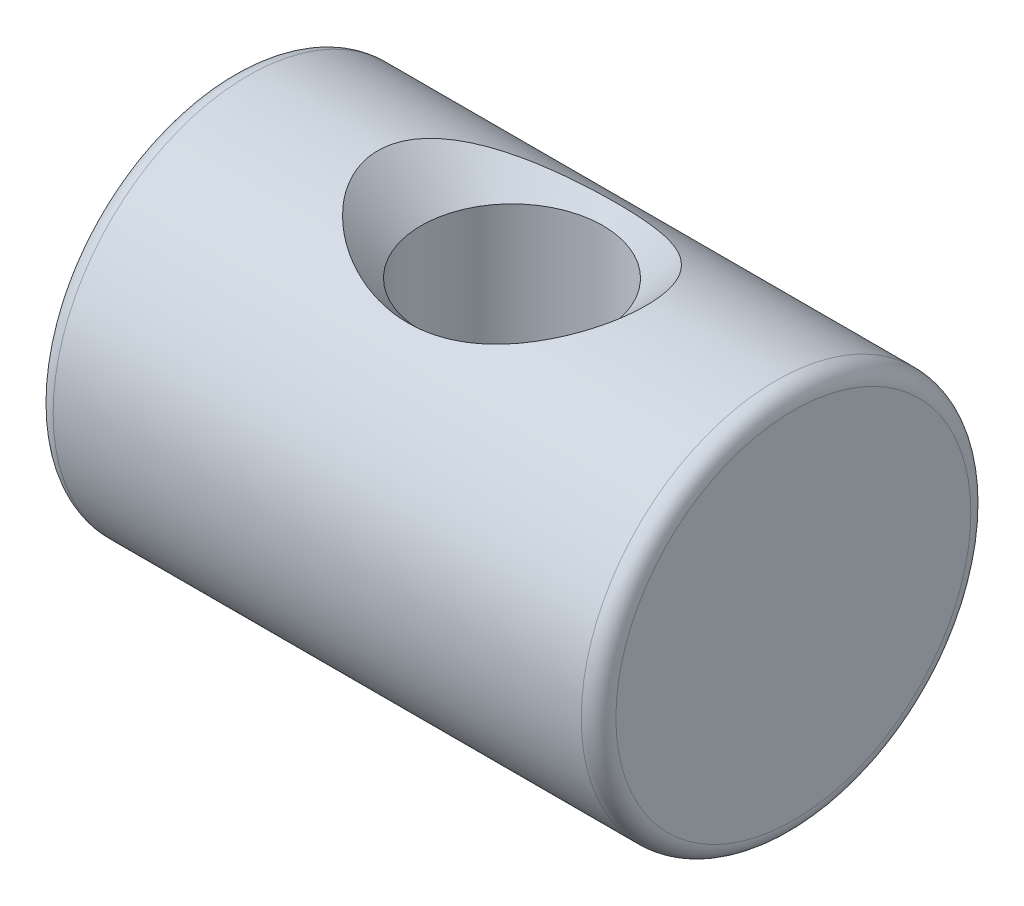
ISO-10303-21;
HEADER;
FILE_DESCRIPTION(('STEP AP214'),'2;1');
FILE_NAME('part.step','',(''),(''),'','','');
FILE_SCHEMA(('AUTOMOTIVE_DESIGN { 1 0 10303 214 1 1 1 1 }'));
ENDSEC;
DATA;
#1=APPLICATION_CONTEXT('core data for automotive mechanical design processes');
#2=APPLICATION_PROTOCOL_DEFINITION('international standard','automotive_design',2000,#1);
#3=PRODUCT_CONTEXT('',#1,'mechanical');
#4=PRODUCT('Part','Part','',(#3));
#5=PRODUCT_RELATED_PRODUCT_CATEGORY('part','',(#4));
#6=PRODUCT_DEFINITION_FORMATION('','',#4);
#7=PRODUCT_DEFINITION_CONTEXT('part definition',#1,'design');
#8=PRODUCT_DEFINITION('design','',#6,#7);
#9=PRODUCT_DEFINITION_SHAPE('','',#8);
#10=(LENGTH_UNIT() NAMED_UNIT(*) SI_UNIT(.MILLI.,.METRE.));
#11=(NAMED_UNIT(*) PLANE_ANGLE_UNIT() SI_UNIT($,.RADIAN.));
#12=(NAMED_UNIT(*) SI_UNIT($,.STERADIAN.) SOLID_ANGLE_UNIT());
#13=UNCERTAINTY_MEASURE_WITH_UNIT(LENGTH_MEASURE(1.E-05),#10,'distance_accuracy_value','');
#14=(GEOMETRIC_REPRESENTATION_CONTEXT(3) GLOBAL_UNCERTAINTY_ASSIGNED_CONTEXT((#13)) GLOBAL_UNIT_ASSIGNED_CONTEXT((#10,
#11,#12)) REPRESENTATION_CONTEXT('',''));
#15=CARTESIAN_POINT('',(0.,0.,0.));
#16=DIRECTION('',(0.,0.,1.));
#17=DIRECTION('',(1.,0.,0.));
#18=AXIS2_PLACEMENT_3D('',#15,#16,#17);
#19=CARTESIAN_POINT('',(-6.5,-4.1492,4.1492));
#20=DIRECTION('',(1.,0.,0.));
#21=DIRECTION('',(0.,0.,-1.));
#22=AXIS2_PLACEMENT_3D('',#19,#20,#21);
#23=PLANE('',#22);
#24=CARTESIAN_POINT('',(-6.49999999988921,0.,0.));
#25=DIRECTION('',(1.,0.,0.));
#26=DIRECTION('',(0.,0.,-1.));
#27=AXIS2_PLACEMENT_3D('',#24,#25,#26);
#28=CIRCLE('',#27,4.09999999965447);
#29=CARTESIAN_POINT('',(-6.49999999988921,0.,-4.09999999965447));
#30=VERTEX_POINT('',#29);
#31=EDGE_CURVE('E19',#30,#30,#28,.T.);
#32=ORIENTED_EDGE('',*,*,#31,.F.);
#33=EDGE_LOOP('',(#32));
#34=FACE_BOUND('',#33,.T.);
#35=ADVANCED_FACE('F15',(#34),#23,.F.);
#36=CARTESIAN_POINT('',(6.5,-4.1492,4.1492));
#37=DIRECTION('',(1.,0.,0.));
#38=DIRECTION('',(0.,0.,-1.));
#39=AXIS2_PLACEMENT_3D('',#36,#37,#38);
#40=PLANE('',#39);
#41=CARTESIAN_POINT('',(6.49999999988921,0.,0.));
#42=DIRECTION('',(1.,0.,0.));
#43=DIRECTION('',(0.,0.,-1.));
#44=AXIS2_PLACEMENT_3D('',#41,#42,#43);
#45=CIRCLE('',#44,4.09999999965447);
#46=CARTESIAN_POINT('',(6.49999999988921,0.,-4.09999999965447));
#47=VERTEX_POINT('',#46);
#48=EDGE_CURVE('E172',#47,#47,#45,.F.);
#49=ORIENTED_EDGE('',*,*,#48,.F.);
#50=EDGE_LOOP('',(#49));
#51=FACE_BOUND('',#50,.T.);
#52=ADVANCED_FACE('F154',(#51),#40,.T.);
#53=CARTESIAN_POINT('',(-6.09999999967373,0.,0.));
#54=DIRECTION('',(1.,0.,0.));
#55=DIRECTION('',(0.,0.,-1.));
#56=AXIS2_PLACEMENT_3D('',#53,#54,#55);
#57=TOROIDAL_SURFACE('',#56,4.09999999967373,0.400000000215483);
#58=CARTESIAN_POINT('',(-6.1,0.,0.));
#59=DIRECTION('',(-1.,0.,0.));
#60=DIRECTION('',(0.,0.,1.));
#61=AXIS2_PLACEMENT_3D('',#58,#59,#60);
#62=CIRCLE('',#61,4.5);
#63=CARTESIAN_POINT('',(-6.1,0.,4.5));
#64=VERTEX_POINT('',#63);
#65=EDGE_CURVE('E31',#64,#64,#62,.T.);
#66=ORIENTED_EDGE('',*,*,#65,.T.);
#67=EDGE_LOOP('',(#66));
#68=FACE_BOUND('',#67,.T.);
#69=ORIENTED_EDGE('',*,*,#31,.T.);
#70=EDGE_LOOP('',(#69));
#71=FACE_BOUND('',#70,.T.);
#72=ADVANCED_FACE('F147',(#68,#71),#57,.T.);
#73=CARTESIAN_POINT('',(6.09999999967373,0.,0.));
#74=DIRECTION('',(1.,0.,0.));
#75=DIRECTION('',(0.,0.,-1.));
#76=AXIS2_PLACEMENT_3D('',#73,#74,#75);
#77=TOROIDAL_SURFACE('',#76,4.09999999967373,0.400000000215483);
#78=ORIENTED_EDGE('',*,*,#48,.T.);
#79=EDGE_LOOP('',(#78));
#80=FACE_BOUND('',#79,.T.);
#81=CARTESIAN_POINT('',(6.1,0.,0.));
#82=DIRECTION('',(-1.,0.,0.));
#83=DIRECTION('',(0.,0.,1.));
#84=AXIS2_PLACEMENT_3D('',#81,#82,#83);
#85=CIRCLE('',#84,4.5);
#86=CARTESIAN_POINT('',(6.1,0.,4.5));
#87=VERTEX_POINT('',#86);
#88=EDGE_CURVE('E33',#87,#87,#85,.F.);
#89=ORIENTED_EDGE('',*,*,#88,.T.);
#90=EDGE_LOOP('',(#89));
#91=FACE_BOUND('',#90,.T.);
#92=ADVANCED_FACE('F17',(#80,#91),#77,.T.);
#93=CARTESIAN_POINT('',(6.1,0.,0.));
#94=DIRECTION('',(-1.,0.,0.));
#95=DIRECTION('',(0.,0.,1.));
#96=AXIS2_PLACEMENT_3D('',#93,#94,#95);
#97=CYLINDRICAL_SURFACE('',#96,4.5);
#98=ORIENTED_EDGE('',*,*,#65,.F.);
#99=EDGE_LOOP('',(#98));
#100=FACE_BOUND('',#99,.T.);
#101=ORIENTED_EDGE('',*,*,#88,.F.);
#102=EDGE_LOOP('',(#101));
#103=FACE_BOUND('',#102,.T.);
#104=CARTESIAN_POINT('',(-9.86149523825186E-10,3.80402963905336,-2.40402963903157));
#105=CARTESIAN_POINT('',(-0.093977154924715,3.80402918428817,-2.40402983174259));
#106=CARTESIAN_POINT('',(-0.187950182434176,3.80617083904371,-2.40065143442985));
#107=CARTESIAN_POINT('',(-0.375250299645652,3.81464883302326,-2.38715678320656));
#108=CARTESIAN_POINT('',(-0.46857717053632,3.82098652909836,-2.37703834980068));
#109=CARTESIAN_POINT('',(-0.653919493083247,3.83760751270613,-2.35011061158031));
#110=CARTESIAN_POINT('',(-0.745934771899099,3.84789131535775,-2.33330043322456));
#111=CARTESIAN_POINT('',(-0.928043034725843,3.87200590232245,-2.29305741543214));
#112=CARTESIAN_POINT('',(-1.01813527829037,3.88583802711818,-2.26962207280344));
#113=CARTESIAN_POINT('',(-1.28617403571492,3.93219395578224,-2.18901182534098));
#114=CARTESIAN_POINT('',(-1.46040052081063,3.96943202036564,-2.12174613201124));
#115=CARTESIAN_POINT('',(-1.79413108294981,4.05144314864474,-1.960601420027));
#116=CARTESIAN_POINT('',(-1.95363918848749,4.09621414101136,-1.86672971238404));
#117=CARTESIAN_POINT('',(-2.21977978045624,4.17752404684498,-1.6752917051254));
#118=CARTESIAN_POINT('',(-2.3303399501026,4.21371724625635,-1.5830417335409));
#119=CARTESIAN_POINT('',(-2.53542402966201,4.28401686603972,-1.38150124785342));
#120=CARTESIAN_POINT('',(-2.62997678444259,4.31812696760124,-1.27224208099847));
#121=CARTESIAN_POINT('',(-2.77808246788113,4.37319748147187,-1.06478830549085));
#122=CARTESIAN_POINT('',(-2.83604444884711,4.39536085962259,-0.970075498301455));
#123=CARTESIAN_POINT('',(-2.93671214849945,4.43446816736024,-0.771796884103253));
#124=CARTESIAN_POINT('',(-2.97942852756254,4.45141574291312,-0.668237326166388));
#125=CARTESIAN_POINT('',(-3.04690917582729,4.47841645389679,-0.453412071271953));
#126=CARTESIAN_POINT('',(-3.07150913316714,4.48840644240632,-0.342085631353546));
#127=CARTESIAN_POINT('',(-3.0997990465411,4.49990841264754,-0.11638590682075));
#128=CARTESIAN_POINT('',(-3.10350672938144,4.50142758174101,-0.00201528797298682));
#129=CARTESIAN_POINT('',(-3.09066534430841,4.49619579127259,0.20939625604824));
#130=CARTESIAN_POINT('',(-3.07684767510446,4.49055986273533,0.306645723469861));
#131=CARTESIAN_POINT('',(-3.03451438560052,4.47345845553929,0.497329146717856));
#132=CARTESIAN_POINT('',(-3.00599611851055,4.46199192710694,0.590762412180257));
#133=CARTESIAN_POINT('',(-2.93528820481526,4.4339689626372,0.773746402025074));
#134=CARTESIAN_POINT('',(-2.89282105822758,4.41730959528457,0.863172519085056));
#135=CARTESIAN_POINT('',(-2.79653313211536,4.38028295580686,1.03481729233455));
#136=CARTESIAN_POINT('',(-2.74270504635452,4.3599132987495,1.11703126198305));
#137=CARTESIAN_POINT('',(-2.59390432029646,4.30502556970607,1.31623406926682));
#138=CARTESIAN_POINT('',(-2.49244223848571,4.26882207728578,1.42792521501275));
#139=CARTESIAN_POINT('',(-2.27282122634323,4.19473707564946,1.63282087708357));
#140=CARTESIAN_POINT('',(-2.15462943893501,4.15685236752296,1.72598812535368));
#141=CARTESIAN_POINT('',(-1.90276007897515,4.08209503029664,1.89613134392174));
#142=CARTESIAN_POINT('',(-1.76879332273953,4.04526450949747,1.97269466435558));
#143=CARTESIAN_POINT('',(-1.49061542104039,3.97681014120196,2.10729532320043));
#144=CARTESIAN_POINT('',(-1.3464042968819,3.94518628287787,2.16533270013815));
#145=CARTESIAN_POINT('',(-1.10291077883195,3.89983553914372,2.24556782111901));
#146=CARTESIAN_POINT('',(-1.00580962404608,3.88373720591831,2.2731784903528));
#147=CARTESIAN_POINT('',(-0.80915454387719,3.85558826789509,2.32060439636241));
#148=CARTESIAN_POINT('',(-0.709601275646821,3.84353659101601,2.34042169807483));
#149=CARTESIAN_POINT('',(-0.508801777098481,3.82401899305874,2.37217751733982));
#150=CARTESIAN_POINT('',(-0.40755552106424,3.81655314170378,2.38411591510118));
#151=CARTESIAN_POINT('',(-0.204204477432668,3.80655903377429,2.40004135264801));
#152=CARTESIAN_POINT('',(-0.102099803570255,3.80403013312529,2.40402942963359));
#153=CARTESIAN_POINT('',(0.0939771536615333,3.80402918425016,2.40402983177488));
#154=CARTESIAN_POINT('',(0.187950181169632,3.80617083900035,2.400651434491));
#155=CARTESIAN_POINT('',(0.37525029838215,3.81464883295219,2.38715678332756));
#156=CARTESIAN_POINT('',(0.468577169275219,3.82098652900495,2.37703834995263));
#157=CARTESIAN_POINT('',(0.653919491830122,3.83760751257407,2.35011061179364));
#158=CARTESIAN_POINT('',(0.745934770651545,3.8478913152094,2.33330043346829));
#159=CARTESIAN_POINT('',(0.928043033492345,3.87200590214222,2.29305741573672));
#160=CARTESIAN_POINT('',(1.01813527706536,3.88583802692236,2.26962207313847));
#161=CARTESIAN_POINT('',(1.2861740345136,3.9321939555423,2.18901182576959));
#162=CARTESIAN_POINT('',(1.4604005196288,3.96943202010074,2.12174613250384));
#163=CARTESIAN_POINT('',(1.79413108181916,4.05144314834128,1.96060142065109));
#164=CARTESIAN_POINT('',(1.95363918738849,4.0962141406943,1.86672971307559));
#165=CARTESIAN_POINT('',(2.21977977948685,4.1775240465342,1.67529170589995));
#166=CARTESIAN_POINT('',(2.3303399492217,4.21371724596317,1.5830417343218));
#167=CARTESIAN_POINT('',(2.53542402895528,4.28401686578871,1.38150124863243));
#168=CARTESIAN_POINT('',(2.62997678382155,4.31812696737479,1.27224208176926));
#169=CARTESIAN_POINT('',(2.77808246739338,4.37319748128709,1.06478830624972));
#170=CARTESIAN_POINT('',(2.83604444841063,4.39536085945485,0.970075499062108));
#171=CARTESIAN_POINT('',(2.93671214816579,4.43446816722879,0.771796884859253));
#172=CARTESIAN_POINT('',(2.97942852728042,4.45141574280093,0.668237326915957));
#173=CARTESIAN_POINT('',(3.04690917564644,4.47841645382371,0.453412071997322));
#174=CARTESIAN_POINT('',(3.0715091330358,4.48840644235303,0.342085632060983));
#175=CARTESIAN_POINT('',(3.09979904650075,4.49990841263102,0.116385907482017));
#176=CARTESIAN_POINT('',(3.10350672938263,4.50142758174151,0.00201528860603225));
#177=CARTESIAN_POINT('',(3.09066534437642,4.49619579130029,-0.209396255459048));
#178=CARTESIAN_POINT('',(3.0768476752018,4.49055986277488,-0.306645722895557));
#179=CARTESIAN_POINT('',(3.03451438575071,4.47345845559973,-0.497329146177217));
#180=CARTESIAN_POINT('',(3.00599611868425,4.46199192717641,-0.590762411658393));
#181=CARTESIAN_POINT('',(2.93528820503791,4.43396896272481,-0.773746401522842));
#182=CARTESIAN_POINT('',(2.89282105847845,4.41730959538231,-0.863172518585018));
#183=CARTESIAN_POINT('',(2.79653313242129,4.38028295592323,-1.03481729184213));
#184=CARTESIAN_POINT('',(2.7427050466873,4.35991329887435,-1.11703126149605));
#185=CARTESIAN_POINT('',(2.59390432070572,4.3050255698538,-1.31623406878294));
#186=CARTESIAN_POINT('',(2.49244223894609,4.26882207744721,-1.42792521453023));
#187=CARTESIAN_POINT('',(2.2728212269062,4.19473707583322,-1.63282087661158));
#188=CARTESIAN_POINT('',(2.1546294395495,4.15685236771534,-1.72598812489089));
#189=CARTESIAN_POINT('',(1.90276007969353,4.08209503049964,-1.89613134348519));
#190=CARTESIAN_POINT('',(1.76879332351028,4.0452645097023,-1.97269466393621));
#191=CARTESIAN_POINT('',(1.49061542191464,3.97681014140196,-2.1072953228238));
#192=CARTESIAN_POINT('',(1.34640429780724,3.94518628307124,-2.16533269978697));
#193=CARTESIAN_POINT('',(1.10291077963847,3.89983553928032,-2.24556782088312));
#194=CARTESIAN_POINT('',(1.00580962467698,3.88373720601492,-2.27317849018789));
#195=CARTESIAN_POINT('',(0.809154544146343,3.85558826792732,-2.32060439631025));
#196=CARTESIAN_POINT('',(0.709601275729843,3.84353659102387,-2.3404216980644));
#197=CARTESIAN_POINT('',(0.508801776803125,3.82401899303024,-2.37217751738383));
#198=CARTESIAN_POINT('',(0.407555520576637,3.81655314166329,-2.38411591515786));
#199=CARTESIAN_POINT('',(0.204204476558725,3.80655903374786,-2.40004135269796));
#200=CARTESIAN_POINT('',(0.102099802502218,3.8040301331249,-2.40402942966412));
#201=CARTESIAN_POINT('',(-9.86149523825186E-10,3.80402963905336,-2.40402963903157));
#202=B_SPLINE_CURVE_WITH_KNOTS('',3,(#104,#105,#106,#107,#108,#109,#110,#111,#112,#113,#114,
#115,#116,#117,#118,#119,#120,#121,#122,#123,#124,#125,#126,#127,#128,#129,#130,#131,#132,#133,
#134,#135,#136,#137,#138,#139,#140,#141,#142,#143,#144,#145,#146,#147,#148,#149,#150,#151,#152,
#153,#154,#155,#156,#157,#158,#159,#160,#161,#162,#163,#164,#165,#166,#167,#168,#169,#170,#171,
#172,#173,#174,#175,#176,#177,#178,#179,#180,#181,#182,#183,#184,#185,#186,#187,#188,#189,#190,
#191,#192,#193,#194,#195,#196,#197,#198,#199,#200,#201),.UNSPECIFIED.,.T.,.F.,(4,2,2,2,2,2,2,2,
2,2,2,2,2,2,2,2,2,2,2,2,2,2,2,2,2,2,2,2,2,2,2,2,2,2,2,2,2,2,2,2,2,2,2,2,2,2,2,2,4),(0.,
0.281839257978405,0.563769697328754,0.845736951990567,1.12781088531847,1.69641773527721,
2.26486849016904,2.70876471773531,3.15185234164784,3.49028667784403,3.82848390048874,
4.16971194153692,4.51065041166058,4.80442279290718,5.09824808530254,5.39831388601375,
5.69857325068967,6.16154095129469,6.62543087112039,7.09978516553701,7.57413847347589,
7.8804542253078,8.18668876071384,8.49292795201676,8.79912718869125,9.08096644666154,
9.36289688600526,9.64486414066141,9.92693807398414,10.4955449239141,11.0639956787779,
11.5078919065419,11.9509795306519,12.2894138669323,12.6276110896613,12.968839130798,
13.3097776010092,13.6035499822849,13.8973752747094,14.1974410753856,14.4977004400263,
14.960668140525,15.4245580602437,15.8989123545519,16.3732656623848,16.6795814147912,
16.985815950772,17.29205514265,17.5982543798999),.UNSPECIFIED.);
#203=CARTESIAN_POINT('',(-9.86149523825186E-10,3.80402963905336,-2.40402963903157));
#204=VERTEX_POINT('',#203);
#205=EDGE_CURVE('E28',#204,#204,#202,.T.);
#206=ORIENTED_EDGE('',*,*,#205,.F.);
#207=EDGE_LOOP('',(#206));
#208=FACE_BOUND('',#207,.T.);
#209=CARTESIAN_POINT('',(-9.86149523824037E-10,-3.80402963904525,2.40402963903247));
#210=CARTESIAN_POINT('',(-0.0939771549244024,-3.80402918428032,2.40402983174346));
#211=CARTESIAN_POINT('',(-0.18795018243355,-3.8061708390416,2.40065143443011));
#212=CARTESIAN_POINT('',(-0.375250299644698,-3.81464883302531,2.38715678320641));
#213=CARTESIAN_POINT('',(-0.46857717053535,-3.82098652909885,2.37703834980073));
#214=CARTESIAN_POINT('',(-0.653919493082249,-3.83760751270546,2.35011061158054));
#215=CARTESIAN_POINT('',(-0.745934771898089,-3.84789131535747,2.33330043322478));
#216=CARTESIAN_POINT('',(-0.928043034724883,-3.87200590232247,2.29305741543236));
#217=CARTESIAN_POINT('',(-1.01813527828947,-3.8858380271181,2.26962207280368));
#218=CARTESIAN_POINT('',(-1.28617403571402,-3.93219395578196,2.18901182534131));
#219=CARTESIAN_POINT('',(-1.46040052080968,-3.9694320203654,2.12174613201163));
#220=CARTESIAN_POINT('',(-1.79413108294867,-4.05144314864446,1.96060142002761));
#221=CARTESIAN_POINT('',(-1.95363918848621,-4.096214141011,1.86672971238482));
#222=CARTESIAN_POINT('',(-2.21977978045497,-4.17752404684456,1.67529170512642));
#223=CARTESIAN_POINT('',(-2.33033995010144,-4.21371724625596,1.58304173354194));
#224=CARTESIAN_POINT('',(-2.53542402966107,-4.28401686603939,1.38150124785445));
#225=CARTESIAN_POINT('',(-2.62997678444178,-4.31812696760094,1.27224208099948));
#226=CARTESIAN_POINT('',(-2.7780824678805,-4.37319748147164,1.06478830549183));
#227=CARTESIAN_POINT('',(-2.83604444884655,-4.39536085962238,0.970075498302439));
#228=CARTESIAN_POINT('',(-2.93671214849902,-4.43446816736007,0.77179688410423));
#229=CARTESIAN_POINT('',(-2.97942852756217,-4.45141574291297,0.668237326167358));
#230=CARTESIAN_POINT('',(-3.04690917582705,-4.47841645389669,0.453412071272895));
#231=CARTESIAN_POINT('',(-3.07150913316697,-4.48840644240625,0.342085631354465));
#232=CARTESIAN_POINT('',(-3.09979904654105,-4.49990841264752,0.11638590682161));
#233=CARTESIAN_POINT('',(-3.10350672938144,-4.50142758174101,0.00201528797380949));
#234=CARTESIAN_POINT('',(-3.0906653443085,-4.49619579127263,-0.209396256047475));
#235=CARTESIAN_POINT('',(-3.07684767510458,-4.49055986273538,-0.306645723469114));
#236=CARTESIAN_POINT('',(-3.03451438560071,-4.47345845553937,-0.497329146717153));
#237=CARTESIAN_POINT('',(-3.00599611851077,-4.46199192710703,-0.590762412179578));
#238=CARTESIAN_POINT('',(-2.93528820481554,-4.43396896263731,-0.773746402024421));
#239=CARTESIAN_POINT('',(-2.8928210582279,-4.41730959528469,-0.863172519084406));
#240=CARTESIAN_POINT('',(-2.79653313211576,-4.38028295580701,-1.03481729233391));
#241=CARTESIAN_POINT('',(-2.74270504635495,-4.35991329874966,-1.11703126198242));
#242=CARTESIAN_POINT('',(-2.59390432029699,-4.30502556970627,-1.31623406926619));
#243=CARTESIAN_POINT('',(-2.49244223848631,-4.26882207728599,-1.42792521501213));
#244=CARTESIAN_POINT('',(-2.27282122634396,-4.1947370756497,-1.63282087708296));
#245=CARTESIAN_POINT('',(-2.15462943893581,-4.15685236752321,-1.72598812535308));
#246=CARTESIAN_POINT('',(-1.90276007897608,-4.08209503029691,-1.89613134392117));
#247=CARTESIAN_POINT('',(-1.76879332274053,-4.04526450949774,-1.97269466435503));
#248=CARTESIAN_POINT('',(-1.49061542104152,-3.97681014120222,-2.10729532319994));
#249=CARTESIAN_POINT('',(-1.3464042968831,-3.94518628287812,-2.1653327001377));
#250=CARTESIAN_POINT('',(-1.1029107788325,-3.8998355391438,-2.24556782111887));
#251=CARTESIAN_POINT('',(-1.00580962404588,-3.88373720591827,-2.27317849035287));
#252=CARTESIAN_POINT('',(-0.809154543875462,-3.85558826789486,-2.3206043963628));
#253=CARTESIAN_POINT('',(-0.709601275644312,-3.84353659101571,-2.34042169807531));
#254=CARTESIAN_POINT('',(-0.508801777094394,-3.8240189930584,-2.37217751734038));
#255=CARTESIAN_POINT('',(-0.407555521059356,-3.81655314170345,-2.38411591510171));
#256=CARTESIAN_POINT('',(-0.204204477426195,-3.80655903377406,-2.40004135264837));
#257=CARTESIAN_POINT('',(-0.102099803562988,-3.80403013312516,-2.4040294296338));
#258=CARTESIAN_POINT('',(0.0939771536685844,-3.80402918425028,-2.40402983177469));
#259=CARTESIAN_POINT('',(0.187950181175676,-3.80617083900055,-2.40065143449069));
#260=CARTESIAN_POINT('',(0.375250298386181,-3.81464883295244,-2.38715678332715));
#261=CARTESIAN_POINT('',(0.468577169278244,-3.82098652900519,-2.37703834995224));
#262=CARTESIAN_POINT('',(0.653919491831156,-3.8376075125742,-2.35011061179344));
#263=CARTESIAN_POINT('',(0.745934770651593,-3.84789131520942,-2.33330043346825));
#264=CARTESIAN_POINT('',(0.928043033490462,-3.87200590214196,-2.29305741573716));
#265=CARTESIAN_POINT('',(1.01813527706253,-3.88583802692192,-2.26962207313922));
#266=CARTESIAN_POINT('',(1.28617403450932,-3.93219395554147,-2.18901182577108));
#267=CARTESIAN_POINT('',(1.46040051962405,-3.96943202009969,-2.12174613250579));
#268=CARTESIAN_POINT('',(1.79413108181358,-4.05144314833979,-1.96060142065413));
#269=CARTESIAN_POINT('',(1.95363918738258,-4.09621414069261,-1.86672971307926));
#270=CARTESIAN_POINT('',(2.21977977948124,-4.1775240465324,-1.67529170590442));
#271=CARTESIAN_POINT('',(2.33033994921661,-4.21371724596148,-1.58304173432631));
#272=CARTESIAN_POINT('',(2.5354240289512,-4.28401686578726,-1.38150124863692));
#273=CARTESIAN_POINT('',(2.62997678381797,-4.31812696737349,-1.2722420817737));
#274=CARTESIAN_POINT('',(2.77808246739056,-4.37319748128602,-1.0647883062541));
#275=CARTESIAN_POINT('',(2.83604444840811,-4.39536085945388,-0.970075499066494));
#276=CARTESIAN_POINT('',(2.93671214816386,-4.43446816722804,-0.771796884863614));
#277=CARTESIAN_POINT('',(2.97942852727879,-4.45141574280029,-0.668237326920281));
#278=CARTESIAN_POINT('',(3.04690917564539,-4.47841645382328,-0.453412072001507));
#279=CARTESIAN_POINT('',(3.07150913303504,-4.48840644235272,-0.342085632065065));
#280=CARTESIAN_POINT('',(3.09979904650052,-4.49990841263093,-0.116385907485834));
#281=CARTESIAN_POINT('',(3.10350672938263,-4.50142758174152,-0.00201528860968671));
#282=CARTESIAN_POINT('',(3.09066534437681,-4.49619579130045,0.209396255455646));
#283=CARTESIAN_POINT('',(3.07684767520236,-4.49055986277511,0.306645722892241));
#284=CARTESIAN_POINT('',(3.03451438575157,-4.47345845560008,0.497329146174096));
#285=CARTESIAN_POINT('',(3.00599611868525,-4.46199192717681,0.590762411655381));
#286=CARTESIAN_POINT('',(2.9352882050392,-4.43396896272532,0.77374640151994));
#287=CARTESIAN_POINT('',(2.8928210584799,-4.41730959538288,0.863172518582127));
#288=CARTESIAN_POINT('',(2.79653313242306,-4.3802829559239,1.03481729183928));
#289=CARTESIAN_POINT('',(2.74270504668922,-4.35991329887507,1.11703126149323));
#290=CARTESIAN_POINT('',(2.59390432070807,-4.30502556985465,1.31623406878016));
#291=CARTESIAN_POINT('',(2.49244223894872,-4.26882207744814,1.42792521452747));
#292=CARTESIAN_POINT('',(2.27282122690943,-4.19473707583427,1.63282087660887));
#293=CARTESIAN_POINT('',(2.15462943955303,-4.15685236771644,1.72598812488822));
#294=CARTESIAN_POINT('',(1.90276007969772,-4.08209503050083,1.89613134348264));
#295=CARTESIAN_POINT('',(1.76879332351481,-4.04526450970352,1.97269466393374));
#296=CARTESIAN_POINT('',(1.49061542191978,-3.97681014140311,2.10729532282159));
#297=CARTESIAN_POINT('',(1.34640429781263,-3.94518628307228,2.16533269978494));
#298=CARTESIAN_POINT('',(1.10291077964357,-3.89983553928125,2.2455678208816));
#299=CARTESIAN_POINT('',(1.00580962468152,-3.88373720601579,2.27317849018667));
#300=CARTESIAN_POINT('',(0.809154544149777,-3.85558826792759,2.32060439630955));
#301=CARTESIAN_POINT('',(0.709601275732738,-3.84353659102358,2.34042169806395));
#302=CARTESIAN_POINT('',(0.508801776804957,-3.82401899303099,2.37217751738353));
#303=CARTESIAN_POINT('',(0.407555520577945,-3.81655314166562,2.38411591515749));
#304=CARTESIAN_POINT('',(0.204204476559247,-3.80655903374561,2.40004135269819));
#305=CARTESIAN_POINT('',(0.102099802502479,-3.80403013311649,2.40402942966505));
#306=CARTESIAN_POINT('',(-9.86149523824037E-10,-3.80402963904525,2.40402963903247));
#307=B_SPLINE_CURVE_WITH_KNOTS('',3,(#209,#210,#211,#212,#213,#214,#215,#216,#217,#218,#219,
#220,#221,#222,#223,#224,#225,#226,#227,#228,#229,#230,#231,#232,#233,#234,#235,#236,#237,#238,
#239,#240,#241,#242,#243,#244,#245,#246,#247,#248,#249,#250,#251,#252,#253,#254,#255,#256,#257,
#258,#259,#260,#261,#262,#263,#264,#265,#266,#267,#268,#269,#270,#271,#272,#273,#274,#275,#276,
#277,#278,#279,#280,#281,#282,#283,#284,#285,#286,#287,#288,#289,#290,#291,#292,#293,#294,#295,
#296,#297,#298,#299,#300,#301,#302,#303,#304,#305,#306),.UNSPECIFIED.,.T.,.F.,(4,2,2,2,2,2,2,2,
2,2,2,2,2,2,2,2,2,2,2,2,2,2,2,2,2,2,2,2,2,2,2,2,2,2,2,2,2,2,2,2,2,2,2,2,2,2,2,2,4),(0.,
0.281839257977741,0.563769697327955,0.845736951989734,1.1278108853178,1.69641773527631,
2.26486849016751,2.708764717734,3.15185234164682,3.49028667784314,3.82848390048794,
4.16971194153624,4.51065041166001,4.80442279290665,5.09824808530205,5.39831388601321,
5.69857325068908,6.16154095129397,6.62543087111953,7.099785165536,7.57413847347475,
7.88045422530901,8.18668876071741,8.49292795202267,8.7991271886995,9.0809664466668,
9.36289688600753,9.64486414066068,9.9269380739804,10.4955449239084,11.0639956787704,
11.5078919065355,11.9509795306466,12.2894138669276,12.6276110896571,12.9688391307943,
13.3097776010059,13.6035499822818,13.8973752747064,14.1974410753824,14.497700440023,
14.9606681405211,15.4245580602392,15.8989123545465,16.373265662379,16.6795814147873,
16.9858159507699,17.2920551426494,17.5982543799004),.UNSPECIFIED.);
#308=CARTESIAN_POINT('',(-9.86149523824037E-10,-3.80402963904525,2.40402963903247));
#309=VERTEX_POINT('',#308);
#310=EDGE_CURVE('E36',#309,#309,#307,.T.);
#311=ORIENTED_EDGE('',*,*,#310,.F.);
#312=EDGE_LOOP('',(#311));
#313=FACE_BOUND('',#312,.T.);
#314=ADVANCED_FACE('F48',(#100,#103,#208,#313),#97,.T.);
#315=CARTESIAN_POINT('',(0.,-3.5,0.));
#316=DIRECTION('',(0.,-1.,0.));
#317=DIRECTION('',(1.,0.,0.));
#318=AXIS2_PLACEMENT_3D('',#315,#316,#317);
#319=CONICAL_SURFACE('',#318,2.1,0.785398163397448);
#320=ORIENTED_EDGE('',*,*,#310,.T.);
#321=EDGE_LOOP('',(#320));
#322=FACE_BOUND('',#321,.T.);
#323=CARTESIAN_POINT('',(0.,-3.5,0.));
#324=DIRECTION('',(0.,1.,0.));
#325=DIRECTION('',(0.,0.,1.));
#326=AXIS2_PLACEMENT_3D('',#323,#324,#325);
#327=CIRCLE('',#326,2.1);
#328=CARTESIAN_POINT('',(0.,-3.5,2.1));
#329=VERTEX_POINT('',#328);
#330=EDGE_CURVE('E23',#329,#329,#327,.F.);
#331=ORIENTED_EDGE('',*,*,#330,.F.);
#332=EDGE_LOOP('',(#331));
#333=FACE_BOUND('',#332,.T.);
#334=ADVANCED_FACE('F56',(#322,#333),#319,.F.);
#335=CARTESIAN_POINT('',(0.,3.5,0.));
#336=DIRECTION('',(0.,1.,0.));
#337=DIRECTION('',(-1.,0.,0.));
#338=AXIS2_PLACEMENT_3D('',#335,#336,#337);
#339=CONICAL_SURFACE('',#338,2.1,0.785398163397448);
#340=ORIENTED_EDGE('',*,*,#205,.T.);
#341=EDGE_LOOP('',(#340));
#342=FACE_BOUND('',#341,.T.);
#343=CARTESIAN_POINT('',(0.,3.5,0.));
#344=DIRECTION('',(0.,1.,0.));
#345=DIRECTION('',(0.,0.,1.));
#346=AXIS2_PLACEMENT_3D('',#343,#344,#345);
#347=CIRCLE('',#346,2.1);
#348=CARTESIAN_POINT('',(0.,3.5,2.1));
#349=VERTEX_POINT('',#348);
#350=EDGE_CURVE('E10',#349,#349,#347,.T.);
#351=ORIENTED_EDGE('',*,*,#350,.F.);
#352=EDGE_LOOP('',(#351));
#353=FACE_BOUND('',#352,.T.);
#354=ADVANCED_FACE('F51',(#342,#353),#339,.F.);
#355=CARTESIAN_POINT('',(0.,-3.5,0.));
#356=DIRECTION('',(0.,1.,0.));
#357=DIRECTION('',(-1.,0.,0.));
#358=AXIS2_PLACEMENT_3D('',#355,#356,#357);
#359=CYLINDRICAL_SURFACE('',#358,2.1);
#360=ORIENTED_EDGE('',*,*,#350,.T.);
#361=EDGE_LOOP('',(#360));
#362=FACE_BOUND('',#361,.T.);
#363=ORIENTED_EDGE('',*,*,#330,.T.);
#364=EDGE_LOOP('',(#363));
#365=FACE_BOUND('',#364,.T.);
#366=ADVANCED_FACE('F55',(#362,#365),#359,.F.);
#367=CLOSED_SHELL('',(#35,#52,#72,#92,#314,#334,#354,#366));
#368=MANIFOLD_SOLID_BREP('B1',#367);
#369=ADVANCED_BREP_SHAPE_REPRESENTATION('',(#18,#368),#14);
#370=SHAPE_DEFINITION_REPRESENTATION(#9,#369);
ENDSEC;
END-ISO-10303-21;
